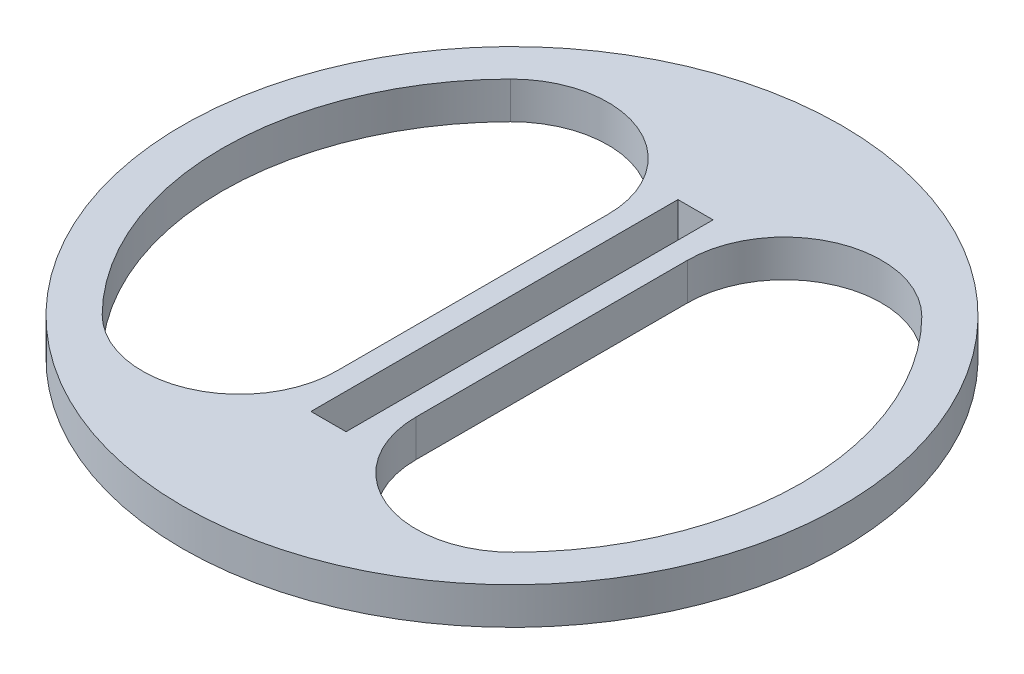
ISO-10303-21;
HEADER;
FILE_DESCRIPTION(('STEP AP214'),'2;1');
FILE_NAME('part.step','',(''),(''),'','','');
FILE_SCHEMA(('AUTOMOTIVE_DESIGN { 1 0 10303 214 1 1 1 1 }'));
ENDSEC;
DATA;
#1=APPLICATION_CONTEXT('core data for automotive mechanical design processes');
#2=APPLICATION_PROTOCOL_DEFINITION('international standard','automotive_design',2000,#1);
#3=PRODUCT_CONTEXT('',#1,'mechanical');
#4=PRODUCT('Part','Part','',(#3));
#5=PRODUCT_RELATED_PRODUCT_CATEGORY('part','',(#4));
#6=PRODUCT_DEFINITION_FORMATION('','',#4);
#7=PRODUCT_DEFINITION_CONTEXT('part definition',#1,'design');
#8=PRODUCT_DEFINITION('design','',#6,#7);
#9=PRODUCT_DEFINITION_SHAPE('','',#8);
#10=(LENGTH_UNIT() NAMED_UNIT(*) SI_UNIT(.MILLI.,.METRE.));
#11=(NAMED_UNIT(*) PLANE_ANGLE_UNIT() SI_UNIT($,.RADIAN.));
#12=(NAMED_UNIT(*) SI_UNIT($,.STERADIAN.) SOLID_ANGLE_UNIT());
#13=UNCERTAINTY_MEASURE_WITH_UNIT(LENGTH_MEASURE(1.E-05),#10,'distance_accuracy_value','');
#14=(GEOMETRIC_REPRESENTATION_CONTEXT(3) GLOBAL_UNCERTAINTY_ASSIGNED_CONTEXT((#13)) GLOBAL_UNIT_ASSIGNED_CONTEXT((#10,
#11,#12)) REPRESENTATION_CONTEXT('',''));
#15=CARTESIAN_POINT('',(0.,0.,0.));
#16=DIRECTION('',(0.,0.,1.));
#17=DIRECTION('',(1.,0.,0.));
#18=AXIS2_PLACEMENT_3D('',#15,#16,#17);
#19=CARTESIAN_POINT('',(0.,4.,0.));
#20=DIRECTION('',(0.,-1.,0.));
#21=DIRECTION('',(0.,0.,-1.));
#22=AXIS2_PLACEMENT_3D('',#19,#20,#21);
#23=CYLINDRICAL_SURFACE('',#22,31.35);
#24=CARTESIAN_POINT('',(0.,4.,0.));
#25=DIRECTION('',(0.,1.,0.));
#26=DIRECTION('',(0.,0.,1.));
#27=AXIS2_PLACEMENT_3D('',#24,#25,#26);
#28=CIRCLE('',#27,31.35);
#29=CARTESIAN_POINT('',(22.2532374100719,4.,22.0820271888922));
#30=VERTEX_POINT('',#29);
#31=CARTESIAN_POINT('',(22.2532374100719,4.,-22.0820271888922));
#32=VERTEX_POINT('',#31);
#33=EDGE_CURVE('E174',#30,#32,#28,.T.);
#34=ORIENTED_EDGE('',*,*,#33,.T.);
#35=DIRECTION('',(0.,-1.,0.));
#36=VECTOR('',#35,1.);
#37=CARTESIAN_POINT('',(22.2532374100719,4.,-22.0820271888922));
#38=LINE('',#37,#36);
#39=CARTESIAN_POINT('',(22.2532374100719,0.,-22.0820271888922));
#40=VERTEX_POINT('',#39);
#41=EDGE_CURVE('E222',#32,#40,#38,.T.);
#42=ORIENTED_EDGE('',*,*,#41,.T.);
#43=CARTESIAN_POINT('',(0.,0.,0.));
#44=DIRECTION('',(0.,1.,0.));
#45=DIRECTION('',(0.,0.,1.));
#46=AXIS2_PLACEMENT_3D('',#43,#44,#45);
#47=CIRCLE('',#46,31.35);
#48=CARTESIAN_POINT('',(22.2532374100719,0.,22.0820271888922));
#49=VERTEX_POINT('',#48);
#50=EDGE_CURVE('E199',#49,#40,#47,.T.);
#51=ORIENTED_EDGE('',*,*,#50,.F.);
#52=DIRECTION('',(0.,-1.,0.));
#53=VECTOR('',#52,1.);
#54=CARTESIAN_POINT('',(22.2532374100719,4.,22.0820271888922));
#55=LINE('',#54,#53);
#56=EDGE_CURVE('E220',#49,#30,#55,.F.);
#57=ORIENTED_EDGE('',*,*,#56,.T.);
#58=EDGE_LOOP('',(#34,#42,#51,#57));
#59=FACE_BOUND('',#58,.T.);
#60=ADVANCED_FACE('F37',(#59),#23,.F.);
#61=CARTESIAN_POINT('',(0.,4.,0.));
#62=DIRECTION('',(0.,-1.,0.));
#63=DIRECTION('',(0.,0.,-1.));
#64=AXIS2_PLACEMENT_3D('',#61,#62,#63);
#65=CYLINDRICAL_SURFACE('',#64,31.35);
#66=CARTESIAN_POINT('',(0.,4.,0.));
#67=DIRECTION('',(0.,1.,0.));
#68=DIRECTION('',(0.,0.,1.));
#69=AXIS2_PLACEMENT_3D('',#66,#67,#68);
#70=CIRCLE('',#69,31.35);
#71=CARTESIAN_POINT('',(-22.2532374100719,4.,-22.0820271888922));
#72=VERTEX_POINT('',#71);
#73=CARTESIAN_POINT('',(-22.2532374100719,4.,22.0820271888922));
#74=VERTEX_POINT('',#73);
#75=EDGE_CURVE('E166',#72,#74,#70,.T.);
#76=ORIENTED_EDGE('',*,*,#75,.T.);
#77=DIRECTION('',(0.,-1.,0.));
#78=VECTOR('',#77,1.);
#79=CARTESIAN_POINT('',(-22.2532374100719,4.,22.0820271888922));
#80=LINE('',#79,#78);
#81=CARTESIAN_POINT('',(-22.2532374100719,0.,22.0820271888922));
#82=VERTEX_POINT('',#81);
#83=EDGE_CURVE('E212',#74,#82,#80,.T.);
#84=ORIENTED_EDGE('',*,*,#83,.T.);
#85=CARTESIAN_POINT('',(0.,0.,0.));
#86=DIRECTION('',(0.,1.,0.));
#87=DIRECTION('',(0.,0.,1.));
#88=AXIS2_PLACEMENT_3D('',#85,#86,#87);
#89=CIRCLE('',#88,31.35);
#90=CARTESIAN_POINT('',(-22.2532374100719,0.,-22.0820271888922));
#91=VERTEX_POINT('',#90);
#92=EDGE_CURVE('E193',#91,#82,#89,.T.);
#93=ORIENTED_EDGE('',*,*,#92,.F.);
#94=DIRECTION('',(0.,-1.,0.));
#95=VECTOR('',#94,1.);
#96=CARTESIAN_POINT('',(-22.2532374100719,4.,-22.0820271888922));
#97=LINE('',#96,#95);
#98=EDGE_CURVE('E136',#91,#72,#97,.F.);
#99=ORIENTED_EDGE('',*,*,#98,.T.);
#100=EDGE_LOOP('',(#76,#84,#93,#99));
#101=FACE_BOUND('',#100,.T.);
#102=ADVANCED_FACE('F266',(#101),#65,.F.);
#103=CARTESIAN_POINT('',(0.,4.,-19.85));
#104=DIRECTION('',(0.,0.,1.));
#105=DIRECTION('',(1.,0.,0.));
#106=AXIS2_PLACEMENT_3D('',#103,#104,#105);
#107=PLANE('',#106);
#108=DIRECTION('',(-1.,0.,0.));
#109=VECTOR('',#108,1.);
#110=CARTESIAN_POINT('',(0.,0.,-19.85));
#111=LINE('',#110,#109);
#112=CARTESIAN_POINT('',(1.9,0.,-19.85));
#113=VERTEX_POINT('',#112);
#114=CARTESIAN_POINT('',(-1.9,0.,-19.85));
#115=VERTEX_POINT('',#114);
#116=EDGE_CURVE('E131',#113,#115,#111,.T.);
#117=ORIENTED_EDGE('',*,*,#116,.F.);
#118=DIRECTION('',(0.,-1.,0.));
#119=VECTOR('',#118,1.);
#120=CARTESIAN_POINT('',(1.9,4.,-19.85));
#121=LINE('',#120,#119);
#122=CARTESIAN_POINT('',(1.9,4.,-19.85));
#123=VERTEX_POINT('',#122);
#124=EDGE_CURVE('E126',#123,#113,#121,.T.);
#125=ORIENTED_EDGE('',*,*,#124,.F.);
#126=DIRECTION('',(-1.,0.,0.));
#127=VECTOR('',#126,1.);
#128=CARTESIAN_POINT('',(0.,4.,-19.85));
#129=LINE('',#128,#127);
#130=CARTESIAN_POINT('',(-1.9,4.,-19.85));
#131=VERTEX_POINT('',#130);
#132=EDGE_CURVE('E129',#123,#131,#129,.T.);
#133=ORIENTED_EDGE('',*,*,#132,.T.);
#134=DIRECTION('',(0.,-1.,0.));
#135=VECTOR('',#134,1.);
#136=CARTESIAN_POINT('',(-1.9,4.,-19.85));
#137=LINE('',#136,#135);
#138=EDGE_CURVE('E184',#131,#115,#137,.T.);
#139=ORIENTED_EDGE('',*,*,#138,.T.);
#140=EDGE_LOOP('',(#117,#125,#133,#139));
#141=FACE_BOUND('',#140,.T.);
#142=ADVANCED_FACE('F128',(#141),#107,.T.);
#143=CARTESIAN_POINT('',(1.9,4.,0.));
#144=DIRECTION('',(-1.,0.,0.));
#145=DIRECTION('',(0.,0.,1.));
#146=AXIS2_PLACEMENT_3D('',#143,#144,#145);
#147=PLANE('',#146);
#148=DIRECTION('',(0.,0.,-1.));
#149=VECTOR('',#148,1.);
#150=CARTESIAN_POINT('',(1.9,0.,0.));
#151=LINE('',#150,#149);
#152=CARTESIAN_POINT('',(1.9,0.,19.85));
#153=VERTEX_POINT('',#152);
#154=EDGE_CURVE('E186',#153,#113,#151,.T.);
#155=ORIENTED_EDGE('',*,*,#154,.F.);
#156=DIRECTION('',(0.,-1.,0.));
#157=VECTOR('',#156,1.);
#158=CARTESIAN_POINT('',(1.9,4.,19.85));
#159=LINE('',#158,#157);
#160=CARTESIAN_POINT('',(1.9,4.,19.85));
#161=VERTEX_POINT('',#160);
#162=EDGE_CURVE('E137',#161,#153,#159,.T.);
#163=ORIENTED_EDGE('',*,*,#162,.F.);
#164=DIRECTION('',(0.,0.,-1.));
#165=VECTOR('',#164,1.);
#166=CARTESIAN_POINT('',(1.9,4.,0.));
#167=LINE('',#166,#165);
#168=EDGE_CURVE('E143',#161,#123,#167,.T.);
#169=ORIENTED_EDGE('',*,*,#168,.T.);
#170=ORIENTED_EDGE('',*,*,#124,.T.);
#171=EDGE_LOOP('',(#155,#163,#169,#170));
#172=FACE_BOUND('',#171,.T.);
#173=ADVANCED_FACE('F149',(#172),#147,.T.);
#174=CARTESIAN_POINT('',(0.,4.,19.85));
#175=DIRECTION('',(0.,0.,1.));
#176=DIRECTION('',(1.,0.,0.));
#177=AXIS2_PLACEMENT_3D('',#174,#175,#176);
#178=PLANE('',#177);
#179=DIRECTION('',(-1.,0.,0.));
#180=VECTOR('',#179,1.);
#181=CARTESIAN_POINT('',(0.,0.,19.85));
#182=LINE('',#181,#180);
#183=CARTESIAN_POINT('',(-1.9,0.,19.85));
#184=VERTEX_POINT('',#183);
#185=EDGE_CURVE('E188',#153,#184,#182,.T.);
#186=ORIENTED_EDGE('',*,*,#185,.T.);
#187=DIRECTION('',(0.,-1.,0.));
#188=VECTOR('',#187,1.);
#189=CARTESIAN_POINT('',(-1.9,4.,19.85));
#190=LINE('',#189,#188);
#191=CARTESIAN_POINT('',(-1.9,4.,19.85));
#192=VERTEX_POINT('',#191);
#193=EDGE_CURVE('E207',#192,#184,#190,.T.);
#194=ORIENTED_EDGE('',*,*,#193,.F.);
#195=DIRECTION('',(-1.,0.,0.));
#196=VECTOR('',#195,1.);
#197=CARTESIAN_POINT('',(0.,4.,19.85));
#198=LINE('',#197,#196);
#199=EDGE_CURVE('E151',#161,#192,#198,.T.);
#200=ORIENTED_EDGE('',*,*,#199,.F.);
#201=ORIENTED_EDGE('',*,*,#162,.T.);
#202=EDGE_LOOP('',(#186,#194,#200,#201));
#203=FACE_BOUND('',#202,.T.);
#204=ADVANCED_FACE('F285',(#203),#178,.F.);
#205=CARTESIAN_POINT('',(4.3,4.,0.));
#206=DIRECTION('',(-1.,0.,0.));
#207=DIRECTION('',(0.,0.,1.));
#208=AXIS2_PLACEMENT_3D('',#205,#206,#207);
#209=PLANE('',#208);
#210=DIRECTION('',(0.,0.,-1.));
#211=VECTOR('',#210,1.);
#212=CARTESIAN_POINT('',(4.3,0.,0.));
#213=LINE('',#212,#211);
#214=CARTESIAN_POINT('',(4.3,0.,14.6861329151006));
#215=VERTEX_POINT('',#214);
#216=CARTESIAN_POINT('',(4.3,0.,-14.6861329151006));
#217=VERTEX_POINT('',#216);
#218=EDGE_CURVE('E202',#215,#217,#213,.T.);
#219=ORIENTED_EDGE('',*,*,#218,.T.);
#220=DIRECTION('',(0.,-1.,0.));
#221=VECTOR('',#220,1.);
#222=CARTESIAN_POINT('',(4.3,4.,-14.6861329151006));
#223=LINE('',#222,#221);
#224=CARTESIAN_POINT('',(4.3,4.,-14.6861329151006));
#225=VERTEX_POINT('',#224);
#226=EDGE_CURVE('E52',#217,#225,#223,.F.);
#227=ORIENTED_EDGE('',*,*,#226,.T.);
#228=DIRECTION('',(0.,0.,-1.));
#229=VECTOR('',#228,1.);
#230=CARTESIAN_POINT('',(4.3,4.,0.));
#231=LINE('',#230,#229);
#232=CARTESIAN_POINT('',(4.3,4.,14.6861329151006));
#233=VERTEX_POINT('',#232);
#234=EDGE_CURVE('E178',#233,#225,#231,.T.);
#235=ORIENTED_EDGE('',*,*,#234,.F.);
#236=DIRECTION('',(0.,-1.,0.));
#237=VECTOR('',#236,1.);
#238=CARTESIAN_POINT('',(4.3,4.,14.6861329151006));
#239=LINE('',#238,#237);
#240=EDGE_CURVE('E225',#233,#215,#239,.T.);
#241=ORIENTED_EDGE('',*,*,#240,.T.);
#242=EDGE_LOOP('',(#219,#227,#235,#241));
#243=FACE_BOUND('',#242,.T.);
#244=ADVANCED_FACE('F251',(#243),#209,.F.);
#245=CARTESIAN_POINT('',(-4.3,4.,0.));
#246=DIRECTION('',(-1.,0.,0.));
#247=DIRECTION('',(0.,0.,1.));
#248=AXIS2_PLACEMENT_3D('',#245,#246,#247);
#249=PLANE('',#248);
#250=DIRECTION('',(0.,0.,-1.));
#251=VECTOR('',#250,1.);
#252=CARTESIAN_POINT('',(-4.3,0.,0.));
#253=LINE('',#252,#251);
#254=CARTESIAN_POINT('',(-4.3,0.,14.6861329151006));
#255=VERTEX_POINT('',#254);
#256=CARTESIAN_POINT('',(-4.3,0.,-14.6861329151006));
#257=VERTEX_POINT('',#256);
#258=EDGE_CURVE('E196',#255,#257,#253,.T.);
#259=ORIENTED_EDGE('',*,*,#258,.F.);
#260=DIRECTION('',(0.,1.,0.));
#261=VECTOR('',#260,1.);
#262=CARTESIAN_POINT('',(-4.3,4.,14.6861329151006));
#263=LINE('',#262,#261);
#264=CARTESIAN_POINT('',(-4.3,4.,14.6861329151006));
#265=VERTEX_POINT('',#264);
#266=EDGE_CURVE('E218',#255,#265,#263,.T.);
#267=ORIENTED_EDGE('',*,*,#266,.T.);
#268=DIRECTION('',(0.,0.,-1.));
#269=VECTOR('',#268,1.);
#270=CARTESIAN_POINT('',(-4.3,4.,0.));
#271=LINE('',#270,#269);
#272=CARTESIAN_POINT('',(-4.3,4.,-14.6861329151006));
#273=VERTEX_POINT('',#272);
#274=EDGE_CURVE('E170',#265,#273,#271,.T.);
#275=ORIENTED_EDGE('',*,*,#274,.T.);
#276=DIRECTION('',(0.,1.,0.));
#277=VECTOR('',#276,1.);
#278=CARTESIAN_POINT('',(-4.3,0.,-14.6861329151006));
#279=LINE('',#278,#277);
#280=EDGE_CURVE('E215',#273,#257,#279,.F.);
#281=ORIENTED_EDGE('',*,*,#280,.T.);
#282=EDGE_LOOP('',(#259,#267,#275,#281));
#283=FACE_BOUND('',#282,.T.);
#284=ADVANCED_FACE('F276',(#283),#249,.T.);
#285=CARTESIAN_POINT('',(-1.9,4.,0.));
#286=DIRECTION('',(-1.,0.,0.));
#287=DIRECTION('',(0.,0.,1.));
#288=AXIS2_PLACEMENT_3D('',#285,#286,#287);
#289=PLANE('',#288);
#290=DIRECTION('',(0.,0.,-1.));
#291=VECTOR('',#290,1.);
#292=CARTESIAN_POINT('',(-1.9,0.,0.));
#293=LINE('',#292,#291);
#294=EDGE_CURVE('E190',#184,#115,#293,.T.);
#295=ORIENTED_EDGE('',*,*,#294,.T.);
#296=ORIENTED_EDGE('',*,*,#138,.F.);
#297=DIRECTION('',(0.,0.,-1.));
#298=VECTOR('',#297,1.);
#299=CARTESIAN_POINT('',(-1.9,4.,0.));
#300=LINE('',#299,#298);
#301=EDGE_CURVE('E145',#192,#131,#300,.T.);
#302=ORIENTED_EDGE('',*,*,#301,.F.);
#303=ORIENTED_EDGE('',*,*,#193,.T.);
#304=EDGE_LOOP('',(#295,#296,#302,#303));
#305=FACE_BOUND('',#304,.T.);
#306=ADVANCED_FACE('F278',(#305),#289,.F.);
#307=CARTESIAN_POINT('',(0.,4.,0.));
#308=DIRECTION('',(0.,-1.,0.));
#309=DIRECTION('',(0.,0.,-1.));
#310=AXIS2_PLACEMENT_3D('',#307,#308,#309);
#311=CYLINDRICAL_SURFACE('',#310,35.65);
#312=CARTESIAN_POINT('',(0.,4.,0.));
#313=DIRECTION('',(0.,1.,0.));
#314=DIRECTION('',(0.,0.,1.));
#315=AXIS2_PLACEMENT_3D('',#312,#313,#314);
#316=CIRCLE('',#315,35.65);
#317=CARTESIAN_POINT('',(0.,4.,35.65));
#318=VERTEX_POINT('',#317);
#319=EDGE_CURVE('E180',#318,#318,#316,.T.);
#320=ORIENTED_EDGE('',*,*,#319,.F.);
#321=EDGE_LOOP('',(#320));
#322=FACE_BOUND('',#321,.T.);
#323=CARTESIAN_POINT('',(0.,0.,0.));
#324=DIRECTION('',(0.,1.,0.));
#325=DIRECTION('',(0.,0.,1.));
#326=AXIS2_PLACEMENT_3D('',#323,#324,#325);
#327=CIRCLE('',#326,35.65);
#328=CARTESIAN_POINT('',(0.,0.,35.65));
#329=VERTEX_POINT('',#328);
#330=EDGE_CURVE('E147',#329,#329,#327,.T.);
#331=ORIENTED_EDGE('',*,*,#330,.T.);
#332=EDGE_LOOP('',(#331));
#333=FACE_BOUND('',#332,.T.);
#334=ADVANCED_FACE('F283',(#322,#333),#311,.T.);
#335=CARTESIAN_POINT('',(0.,4.,0.));
#336=DIRECTION('',(0.,1.,0.));
#337=DIRECTION('',(0.,0.,1.));
#338=AXIS2_PLACEMENT_3D('',#335,#336,#337);
#339=PLANE('',#338);
#340=ORIENTED_EDGE('',*,*,#132,.F.);
#341=ORIENTED_EDGE('',*,*,#168,.F.);
#342=ORIENTED_EDGE('',*,*,#199,.T.);
#343=ORIENTED_EDGE('',*,*,#301,.T.);
#344=EDGE_LOOP('',(#340,#341,#342,#343));
#345=FACE_BOUND('',#344,.T.);
#346=ORIENTED_EDGE('',*,*,#75,.F.);
#347=CARTESIAN_POINT('',(-14.8,4.,-14.6861329151006));
#348=DIRECTION('',(0.,1.,0.));
#349=DIRECTION('',(0.,0.,1.));
#350=AXIS2_PLACEMENT_3D('',#347,#348,#349);
#351=CIRCLE('',#350,10.5);
#352=EDGE_CURVE('E235',#72,#273,#351,.F.);
#353=ORIENTED_EDGE('',*,*,#352,.T.);
#354=ORIENTED_EDGE('',*,*,#274,.F.);
#355=CARTESIAN_POINT('',(-14.8,4.,14.6861329151006));
#356=DIRECTION('',(0.,1.,0.));
#357=DIRECTION('',(0.,0.,1.));
#358=AXIS2_PLACEMENT_3D('',#355,#356,#357);
#359=CIRCLE('',#358,10.5);
#360=EDGE_CURVE('E231',#265,#74,#359,.F.);
#361=ORIENTED_EDGE('',*,*,#360,.T.);
#362=EDGE_LOOP('',(#346,#353,#354,#361));
#363=FACE_BOUND('',#362,.T.);
#364=ORIENTED_EDGE('',*,*,#33,.F.);
#365=CARTESIAN_POINT('',(14.8,4.,14.6861329151006));
#366=DIRECTION('',(0.,1.,0.));
#367=DIRECTION('',(0.,0.,1.));
#368=AXIS2_PLACEMENT_3D('',#365,#366,#367);
#369=CIRCLE('',#368,10.5);
#370=EDGE_CURVE('E12',#30,#233,#369,.F.);
#371=ORIENTED_EDGE('',*,*,#370,.T.);
#372=ORIENTED_EDGE('',*,*,#234,.T.);
#373=CARTESIAN_POINT('',(14.8,4.,-14.6861329151006));
#374=DIRECTION('',(0.,1.,0.));
#375=DIRECTION('',(0.,0.,1.));
#376=AXIS2_PLACEMENT_3D('',#373,#374,#375);
#377=CIRCLE('',#376,10.5);
#378=EDGE_CURVE('E239',#225,#32,#377,.F.);
#379=ORIENTED_EDGE('',*,*,#378,.T.);
#380=EDGE_LOOP('',(#364,#371,#372,#379));
#381=FACE_BOUND('',#380,.T.);
#382=ORIENTED_EDGE('',*,*,#319,.T.);
#383=EDGE_LOOP('',(#382));
#384=FACE_BOUND('',#383,.T.);
#385=ADVANCED_FACE('F141',(#345,#363,#381,#384),#339,.T.);
#386=CARTESIAN_POINT('',(0.,0.,0.));
#387=DIRECTION('',(0.,1.,0.));
#388=DIRECTION('',(0.,0.,1.));
#389=AXIS2_PLACEMENT_3D('',#386,#387,#388);
#390=PLANE('',#389);
#391=ORIENTED_EDGE('',*,*,#116,.T.);
#392=ORIENTED_EDGE('',*,*,#294,.F.);
#393=ORIENTED_EDGE('',*,*,#185,.F.);
#394=ORIENTED_EDGE('',*,*,#154,.T.);
#395=EDGE_LOOP('',(#391,#392,#393,#394));
#396=FACE_BOUND('',#395,.T.);
#397=ORIENTED_EDGE('',*,*,#258,.T.);
#398=CARTESIAN_POINT('',(-14.8,0.,-14.6861329151006));
#399=DIRECTION('',(0.,1.,0.));
#400=DIRECTION('',(0.,0.,1.));
#401=AXIS2_PLACEMENT_3D('',#398,#399,#400);
#402=CIRCLE('',#401,10.5);
#403=EDGE_CURVE('E233',#257,#91,#402,.T.);
#404=ORIENTED_EDGE('',*,*,#403,.T.);
#405=ORIENTED_EDGE('',*,*,#92,.T.);
#406=CARTESIAN_POINT('',(-14.8,0.,14.6861329151006));
#407=DIRECTION('',(0.,1.,0.));
#408=DIRECTION('',(0.,0.,1.));
#409=AXIS2_PLACEMENT_3D('',#406,#407,#408);
#410=CIRCLE('',#409,10.5);
#411=EDGE_CURVE('E229',#82,#255,#410,.T.);
#412=ORIENTED_EDGE('',*,*,#411,.T.);
#413=EDGE_LOOP('',(#397,#404,#405,#412));
#414=FACE_BOUND('',#413,.T.);
#415=ORIENTED_EDGE('',*,*,#218,.F.);
#416=CARTESIAN_POINT('',(14.8,0.,14.6861329151006));
#417=DIRECTION('',(0.,1.,0.));
#418=DIRECTION('',(0.,0.,1.));
#419=AXIS2_PLACEMENT_3D('',#416,#417,#418);
#420=CIRCLE('',#419,10.5);
#421=EDGE_CURVE('E45',#215,#49,#420,.T.);
#422=ORIENTED_EDGE('',*,*,#421,.T.);
#423=ORIENTED_EDGE('',*,*,#50,.T.);
#424=CARTESIAN_POINT('',(14.8,0.,-14.6861329151006));
#425=DIRECTION('',(0.,1.,0.));
#426=DIRECTION('',(0.,0.,1.));
#427=AXIS2_PLACEMENT_3D('',#424,#425,#426);
#428=CIRCLE('',#427,10.5);
#429=EDGE_CURVE('E237',#40,#217,#428,.T.);
#430=ORIENTED_EDGE('',*,*,#429,.T.);
#431=EDGE_LOOP('',(#415,#422,#423,#430));
#432=FACE_BOUND('',#431,.T.);
#433=ORIENTED_EDGE('',*,*,#330,.F.);
#434=EDGE_LOOP('',(#433));
#435=FACE_BOUND('',#434,.T.);
#436=ADVANCED_FACE('F243',(#396,#414,#432,#435),#390,.F.);
#437=CARTESIAN_POINT('',(-14.8,4.,14.6861329151006));
#438=DIRECTION('',(0.,-1.,0.));
#439=DIRECTION('',(0.,0.,-1.));
#440=AXIS2_PLACEMENT_3D('',#437,#438,#439);
#441=CYLINDRICAL_SURFACE('',#440,10.5);
#442=ORIENTED_EDGE('',*,*,#360,.F.);
#443=ORIENTED_EDGE('',*,*,#266,.F.);
#444=ORIENTED_EDGE('',*,*,#411,.F.);
#445=ORIENTED_EDGE('',*,*,#83,.F.);
#446=EDGE_LOOP('',(#442,#443,#444,#445));
#447=FACE_BOUND('',#446,.T.);
#448=ADVANCED_FACE('F262',(#447),#441,.F.);
#449=CARTESIAN_POINT('',(-14.8,4.,-14.6861329151006));
#450=DIRECTION('',(0.,-1.,0.));
#451=DIRECTION('',(0.,0.,-1.));
#452=AXIS2_PLACEMENT_3D('',#449,#450,#451);
#453=CYLINDRICAL_SURFACE('',#452,10.5);
#454=ORIENTED_EDGE('',*,*,#352,.F.);
#455=ORIENTED_EDGE('',*,*,#98,.F.);
#456=ORIENTED_EDGE('',*,*,#403,.F.);
#457=ORIENTED_EDGE('',*,*,#280,.F.);
#458=EDGE_LOOP('',(#454,#455,#456,#457));
#459=FACE_BOUND('',#458,.T.);
#460=ADVANCED_FACE('F257',(#459),#453,.F.);
#461=CARTESIAN_POINT('',(14.8,4.,-14.6861329151006));
#462=DIRECTION('',(0.,-1.,0.));
#463=DIRECTION('',(0.,0.,-1.));
#464=AXIS2_PLACEMENT_3D('',#461,#462,#463);
#465=CYLINDRICAL_SURFACE('',#464,10.5);
#466=ORIENTED_EDGE('',*,*,#378,.F.);
#467=ORIENTED_EDGE('',*,*,#226,.F.);
#468=ORIENTED_EDGE('',*,*,#429,.F.);
#469=ORIENTED_EDGE('',*,*,#41,.F.);
#470=EDGE_LOOP('',(#466,#467,#468,#469));
#471=FACE_BOUND('',#470,.T.);
#472=ADVANCED_FACE('F255',(#471),#465,.F.);
#473=CARTESIAN_POINT('',(14.8,4.,14.6861329151006));
#474=DIRECTION('',(0.,-1.,0.));
#475=DIRECTION('',(0.,0.,-1.));
#476=AXIS2_PLACEMENT_3D('',#473,#474,#475);
#477=CYLINDRICAL_SURFACE('',#476,10.5);
#478=ORIENTED_EDGE('',*,*,#370,.F.);
#479=ORIENTED_EDGE('',*,*,#56,.F.);
#480=ORIENTED_EDGE('',*,*,#421,.F.);
#481=ORIENTED_EDGE('',*,*,#240,.F.);
#482=EDGE_LOOP('',(#478,#479,#480,#481));
#483=FACE_BOUND('',#482,.T.);
#484=ADVANCED_FACE('F39',(#483),#477,.F.);
#485=CLOSED_SHELL('',(#60,#102,#142,#173,#204,#244,#284,#306,#334,#385,#436,#448,#460,#472,#484));
#486=MANIFOLD_SOLID_BREP('B2',#485);
#487=ADVANCED_BREP_SHAPE_REPRESENTATION('',(#18,#486),#14);
#488=SHAPE_DEFINITION_REPRESENTATION(#9,#487);
ENDSEC;
END-ISO-10303-21;
